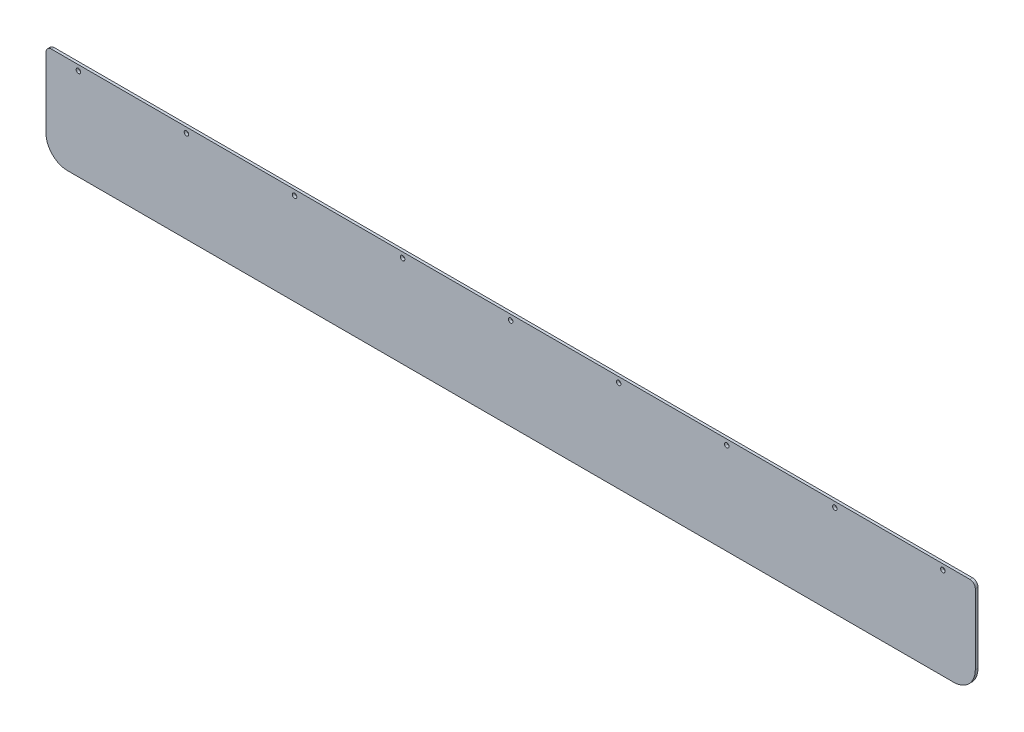
ISO-10303-21;
HEADER;
FILE_DESCRIPTION(('STEP AP214'),'2;1');
FILE_NAME('part.step','',(''),(''),'','','');
FILE_SCHEMA(('AUTOMOTIVE_DESIGN { 1 0 10303 214 1 1 1 1 }'));
ENDSEC;
DATA;
#1=APPLICATION_CONTEXT('core data for automotive mechanical design processes');
#2=APPLICATION_PROTOCOL_DEFINITION('international standard','automotive_design',2000,#1);
#3=PRODUCT_CONTEXT('',#1,'mechanical');
#4=PRODUCT('Part','Part','',(#3));
#5=PRODUCT_RELATED_PRODUCT_CATEGORY('part','',(#4));
#6=PRODUCT_DEFINITION_FORMATION('','',#4);
#7=PRODUCT_DEFINITION_CONTEXT('part definition',#1,'design');
#8=PRODUCT_DEFINITION('design','',#6,#7);
#9=PRODUCT_DEFINITION_SHAPE('','',#8);
#10=(LENGTH_UNIT() NAMED_UNIT(*) SI_UNIT(.MILLI.,.METRE.));
#11=(NAMED_UNIT(*) PLANE_ANGLE_UNIT() SI_UNIT($,.RADIAN.));
#12=(NAMED_UNIT(*) SI_UNIT($,.STERADIAN.) SOLID_ANGLE_UNIT());
#13=UNCERTAINTY_MEASURE_WITH_UNIT(LENGTH_MEASURE(1.E-05),#10,'distance_accuracy_value','');
#14=(GEOMETRIC_REPRESENTATION_CONTEXT(3) GLOBAL_UNCERTAINTY_ASSIGNED_CONTEXT((#13)) GLOBAL_UNIT_ASSIGNED_CONTEXT((#10,
#11,#12)) REPRESENTATION_CONTEXT('',''));
#15=CARTESIAN_POINT('',(0.,0.,0.));
#16=DIRECTION('',(0.,0.,1.));
#17=DIRECTION('',(1.,0.,0.));
#18=AXIS2_PLACEMENT_3D('',#15,#16,#17);
#19=CARTESIAN_POINT('',(76.2,228.6,63.5));
#20=DIRECTION('',(0.,0.,1.));
#21=DIRECTION('',(1.,0.,0.));
#22=AXIS2_PLACEMENT_3D('',#19,#20,#21);
#23=PLANE('',#22);
#24=CARTESIAN_POINT('',(152.4,215.9,63.5));
#25=DIRECTION('',(0.,0.,1.));
#26=DIRECTION('',(1.,0.,0.));
#27=AXIS2_PLACEMENT_3D('',#24,#25,#26);
#28=CIRCLE('',#27,5.3578125);
#29=CARTESIAN_POINT('',(157.7578125,215.9,63.5));
#30=VERTEX_POINT('',#29);
#31=EDGE_CURVE('E135',#30,#30,#28,.T.);
#32=ORIENTED_EDGE('',*,*,#31,.T.);
#33=EDGE_LOOP('',(#32));
#34=FACE_BOUND('',#33,.T.);
#35=CARTESIAN_POINT('',(406.4,215.9,63.5));
#36=DIRECTION('',(0.,0.,1.));
#37=DIRECTION('',(1.,0.,0.));
#38=AXIS2_PLACEMENT_3D('',#35,#36,#37);
#39=CIRCLE('',#38,5.35781249999996);
#40=CARTESIAN_POINT('',(411.7578125,215.9,63.5));
#41=VERTEX_POINT('',#40);
#42=EDGE_CURVE('E286',#41,#41,#39,.T.);
#43=ORIENTED_EDGE('',*,*,#42,.T.);
#44=EDGE_LOOP('',(#43));
#45=FACE_BOUND('',#44,.T.);
#46=CARTESIAN_POINT('',(660.4,215.9,63.5));
#47=DIRECTION('',(0.,0.,1.));
#48=DIRECTION('',(1.,0.,0.));
#49=AXIS2_PLACEMENT_3D('',#46,#47,#48);
#50=CIRCLE('',#49,5.35781249999997);
#51=CARTESIAN_POINT('',(665.7578125,215.9,63.5));
#52=VERTEX_POINT('',#51);
#53=EDGE_CURVE('E292',#52,#52,#50,.T.);
#54=ORIENTED_EDGE('',*,*,#53,.T.);
#55=EDGE_LOOP('',(#54));
#56=FACE_BOUND('',#55,.T.);
#57=CARTESIAN_POINT('',(914.4,215.9,63.5));
#58=DIRECTION('',(0.,0.,1.));
#59=DIRECTION('',(1.,0.,0.));
#60=AXIS2_PLACEMENT_3D('',#57,#58,#59);
#61=CIRCLE('',#60,5.35781249999997);
#62=CARTESIAN_POINT('',(919.7578125,215.9,63.5));
#63=VERTEX_POINT('',#62);
#64=EDGE_CURVE('E307',#63,#63,#61,.T.);
#65=ORIENTED_EDGE('',*,*,#64,.T.);
#66=EDGE_LOOP('',(#65));
#67=FACE_BOUND('',#66,.T.);
#68=CARTESIAN_POINT('',(1168.4,215.9,63.5));
#69=DIRECTION('',(0.,0.,1.));
#70=DIRECTION('',(1.,0.,0.));
#71=AXIS2_PLACEMENT_3D('',#68,#69,#70);
#72=CIRCLE('',#71,5.35781250000008);
#73=CARTESIAN_POINT('',(1173.7578125,215.9,63.5));
#74=VERTEX_POINT('',#73);
#75=EDGE_CURVE('E315',#74,#74,#72,.T.);
#76=ORIENTED_EDGE('',*,*,#75,.T.);
#77=EDGE_LOOP('',(#76));
#78=FACE_BOUND('',#77,.T.);
#79=CARTESIAN_POINT('',(1422.4,215.9,63.5));
#80=DIRECTION('',(0.,0.,1.));
#81=DIRECTION('',(1.,0.,0.));
#82=AXIS2_PLACEMENT_3D('',#79,#80,#81);
#83=CIRCLE('',#82,5.35781250000008);
#84=CARTESIAN_POINT('',(1427.7578125,215.9,63.5));
#85=VERTEX_POINT('',#84);
#86=EDGE_CURVE('E323',#85,#85,#83,.T.);
#87=ORIENTED_EDGE('',*,*,#86,.T.);
#88=EDGE_LOOP('',(#87));
#89=FACE_BOUND('',#88,.T.);
#90=CARTESIAN_POINT('',(1676.4,215.9,63.5));
#91=DIRECTION('',(0.,0.,1.));
#92=DIRECTION('',(1.,0.,0.));
#93=AXIS2_PLACEMENT_3D('',#90,#91,#92);
#94=CIRCLE('',#93,5.35781250000008);
#95=CARTESIAN_POINT('',(1681.7578125,215.9,63.5));
#96=VERTEX_POINT('',#95);
#97=EDGE_CURVE('E331',#96,#96,#94,.T.);
#98=ORIENTED_EDGE('',*,*,#97,.T.);
#99=EDGE_LOOP('',(#98));
#100=FACE_BOUND('',#99,.T.);
#101=CARTESIAN_POINT('',(1930.4,215.9,63.5));
#102=DIRECTION('',(0.,0.,1.));
#103=DIRECTION('',(1.,0.,0.));
#104=AXIS2_PLACEMENT_3D('',#101,#102,#103);
#105=CIRCLE('',#104,5.35781250000008);
#106=CARTESIAN_POINT('',(1935.7578125,215.9,63.5));
#107=VERTEX_POINT('',#106);
#108=EDGE_CURVE('E339',#107,#107,#105,.T.);
#109=ORIENTED_EDGE('',*,*,#108,.T.);
#110=EDGE_LOOP('',(#109));
#111=FACE_BOUND('',#110,.T.);
#112=CARTESIAN_POINT('',(2184.4,215.9,63.5));
#113=DIRECTION('',(0.,0.,1.));
#114=DIRECTION('',(1.,0.,0.));
#115=AXIS2_PLACEMENT_3D('',#112,#113,#114);
#116=CIRCLE('',#115,5.3578125000001);
#117=CARTESIAN_POINT('',(2189.7578125,215.9,63.5));
#118=VERTEX_POINT('',#117);
#119=EDGE_CURVE('E346',#118,#118,#116,.T.);
#120=ORIENTED_EDGE('',*,*,#119,.T.);
#121=EDGE_LOOP('',(#120));
#122=FACE_BOUND('',#121,.T.);
#123=DIRECTION('',(0.,-1.,0.));
#124=VECTOR('',#123,1.);
#125=CARTESIAN_POINT('',(76.2,228.6,63.5));
#126=LINE('',#125,#124);
#127=CARTESIAN_POINT('',(76.2,215.9,63.5));
#128=VERTEX_POINT('',#127);
#129=CARTESIAN_POINT('',(76.2,50.8,63.5));
#130=VERTEX_POINT('',#129);
#131=EDGE_CURVE('E141',#128,#130,#126,.T.);
#132=ORIENTED_EDGE('',*,*,#131,.F.);
#133=CARTESIAN_POINT('',(88.9,215.9,63.5));
#134=DIRECTION('',(0.,0.,1.));
#135=DIRECTION('',(1.,0.,0.));
#136=AXIS2_PLACEMENT_3D('',#133,#134,#135);
#137=CIRCLE('',#136,12.7);
#138=CARTESIAN_POINT('',(88.9,228.6,63.5));
#139=VERTEX_POINT('',#138);
#140=EDGE_CURVE('E172',#128,#139,#137,.F.);
#141=ORIENTED_EDGE('',*,*,#140,.T.);
#142=DIRECTION('',(1.,0.,0.));
#143=VECTOR('',#142,1.);
#144=CARTESIAN_POINT('',(76.2,228.6,63.5));
#145=LINE('',#144,#143);
#146=CARTESIAN_POINT('',(2247.9,228.6,63.5));
#147=VERTEX_POINT('',#146);
#148=EDGE_CURVE('E198',#147,#139,#145,.F.);
#149=ORIENTED_EDGE('',*,*,#148,.F.);
#150=CARTESIAN_POINT('',(2247.9,215.9,63.5));
#151=DIRECTION('',(0.,0.,1.));
#152=DIRECTION('',(1.,0.,0.));
#153=AXIS2_PLACEMENT_3D('',#150,#151,#152);
#154=CIRCLE('',#153,12.7);
#155=CARTESIAN_POINT('',(2260.6,215.9,63.5));
#156=VERTEX_POINT('',#155);
#157=EDGE_CURVE('E169',#147,#156,#154,.F.);
#158=ORIENTED_EDGE('',*,*,#157,.T.);
#159=DIRECTION('',(0.,-1.,0.));
#160=VECTOR('',#159,1.);
#161=CARTESIAN_POINT('',(2260.6,228.6,63.5));
#162=LINE('',#161,#160);
#163=CARTESIAN_POINT('',(2260.6,50.8,63.5));
#164=VERTEX_POINT('',#163);
#165=EDGE_CURVE('E116',#156,#164,#162,.T.);
#166=ORIENTED_EDGE('',*,*,#165,.T.);
#167=CARTESIAN_POINT('',(2209.8,50.8,63.5));
#168=DIRECTION('',(0.,0.,1.));
#169=DIRECTION('',(1.,0.,0.));
#170=AXIS2_PLACEMENT_3D('',#167,#168,#169);
#171=CIRCLE('',#170,50.8);
#172=CARTESIAN_POINT('',(2209.8,0.,63.5));
#173=VERTEX_POINT('',#172);
#174=EDGE_CURVE('E110',#164,#173,#171,.F.);
#175=ORIENTED_EDGE('',*,*,#174,.T.);
#176=DIRECTION('',(1.,0.,0.));
#177=VECTOR('',#176,1.);
#178=CARTESIAN_POINT('',(76.2,0.,63.5));
#179=LINE('',#178,#177);
#180=CARTESIAN_POINT('',(127.,0.,63.5));
#181=VERTEX_POINT('',#180);
#182=EDGE_CURVE('E114',#173,#181,#179,.F.);
#183=ORIENTED_EDGE('',*,*,#182,.T.);
#184=CARTESIAN_POINT('',(127.,50.8,63.5));
#185=DIRECTION('',(0.,0.,1.));
#186=DIRECTION('',(1.,0.,0.));
#187=AXIS2_PLACEMENT_3D('',#184,#185,#186);
#188=CIRCLE('',#187,50.8);
#189=EDGE_CURVE('E122',#181,#130,#188,.F.);
#190=ORIENTED_EDGE('',*,*,#189,.T.);
#191=EDGE_LOOP('',(#132,#141,#149,#158,#166,#175,#183,#190));
#192=FACE_BOUND('',#191,.T.);
#193=ADVANCED_FACE('F42',(#34,#45,#56,#67,#78,#89,#100,#111,#122,#192),#23,.F.);
#194=CARTESIAN_POINT('',(76.2,228.6,69.85));
#195=DIRECTION('',(-1.,0.,0.));
#196=DIRECTION('',(0.,0.,1.));
#197=AXIS2_PLACEMENT_3D('',#194,#195,#196);
#198=PLANE('',#197);
#199=DIRECTION('',(0.,-1.,0.));
#200=VECTOR('',#199,1.);
#201=CARTESIAN_POINT('',(76.2,228.6,69.85));
#202=LINE('',#201,#200);
#203=CARTESIAN_POINT('',(76.2,215.9,69.85));
#204=VERTEX_POINT('',#203);
#205=CARTESIAN_POINT('',(76.2,50.8,69.85));
#206=VERTEX_POINT('',#205);
#207=EDGE_CURVE('E147',#204,#206,#202,.T.);
#208=ORIENTED_EDGE('',*,*,#207,.F.);
#209=DIRECTION('',(0.,0.,-1.));
#210=VECTOR('',#209,1.);
#211=CARTESIAN_POINT('',(76.2,215.9,69.85));
#212=LINE('',#211,#210);
#213=EDGE_CURVE('E165',#204,#128,#212,.T.);
#214=ORIENTED_EDGE('',*,*,#213,.T.);
#215=ORIENTED_EDGE('',*,*,#131,.T.);
#216=DIRECTION('',(0.,0.,-1.));
#217=VECTOR('',#216,1.);
#218=CARTESIAN_POINT('',(76.2,50.8,69.85));
#219=LINE('',#218,#217);
#220=EDGE_CURVE('E153',#130,#206,#219,.F.);
#221=ORIENTED_EDGE('',*,*,#220,.T.);
#222=EDGE_LOOP('',(#208,#214,#215,#221));
#223=FACE_BOUND('',#222,.T.);
#224=ADVANCED_FACE('F191',(#223),#198,.T.);
#225=CARTESIAN_POINT('',(76.2,228.6,69.85));
#226=DIRECTION('',(0.,0.,1.));
#227=DIRECTION('',(1.,0.,0.));
#228=AXIS2_PLACEMENT_3D('',#225,#226,#227);
#229=PLANE('',#228);
#230=CARTESIAN_POINT('',(152.4,215.9,69.85));
#231=DIRECTION('',(0.,0.,1.));
#232=DIRECTION('',(1.,0.,0.));
#233=AXIS2_PLACEMENT_3D('',#230,#231,#232);
#234=CIRCLE('',#233,5.3578125);
#235=CARTESIAN_POINT('',(157.7578125,215.9,69.85));
#236=VERTEX_POINT('',#235);
#237=EDGE_CURVE('E297',#236,#236,#234,.T.);
#238=ORIENTED_EDGE('',*,*,#237,.F.);
#239=EDGE_LOOP('',(#238));
#240=FACE_BOUND('',#239,.T.);
#241=CARTESIAN_POINT('',(406.4,215.9,69.85));
#242=DIRECTION('',(0.,0.,1.));
#243=DIRECTION('',(1.,0.,0.));
#244=AXIS2_PLACEMENT_3D('',#241,#242,#243);
#245=CIRCLE('',#244,5.35781249999996);
#246=CARTESIAN_POINT('',(411.7578125,215.9,69.85));
#247=VERTEX_POINT('',#246);
#248=EDGE_CURVE('E289',#247,#247,#245,.T.);
#249=ORIENTED_EDGE('',*,*,#248,.F.);
#250=EDGE_LOOP('',(#249));
#251=FACE_BOUND('',#250,.T.);
#252=CARTESIAN_POINT('',(660.4,215.9,69.85));
#253=DIRECTION('',(0.,0.,1.));
#254=DIRECTION('',(1.,0.,0.));
#255=AXIS2_PLACEMENT_3D('',#252,#253,#254);
#256=CIRCLE('',#255,5.35781249999997);
#257=CARTESIAN_POINT('',(665.7578125,215.9,69.85));
#258=VERTEX_POINT('',#257);
#259=EDGE_CURVE('E300',#258,#258,#256,.T.);
#260=ORIENTED_EDGE('',*,*,#259,.F.);
#261=EDGE_LOOP('',(#260));
#262=FACE_BOUND('',#261,.T.);
#263=CARTESIAN_POINT('',(914.4,215.9,69.85));
#264=DIRECTION('',(0.,0.,1.));
#265=DIRECTION('',(1.,0.,0.));
#266=AXIS2_PLACEMENT_3D('',#263,#264,#265);
#267=CIRCLE('',#266,5.35781249999997);
#268=CARTESIAN_POINT('',(919.7578125,215.9,69.85));
#269=VERTEX_POINT('',#268);
#270=EDGE_CURVE('E311',#269,#269,#267,.T.);
#271=ORIENTED_EDGE('',*,*,#270,.F.);
#272=EDGE_LOOP('',(#271));
#273=FACE_BOUND('',#272,.T.);
#274=CARTESIAN_POINT('',(1168.4,215.9,69.85));
#275=DIRECTION('',(0.,0.,1.));
#276=DIRECTION('',(1.,0.,0.));
#277=AXIS2_PLACEMENT_3D('',#274,#275,#276);
#278=CIRCLE('',#277,5.35781250000008);
#279=CARTESIAN_POINT('',(1173.7578125,215.9,69.85));
#280=VERTEX_POINT('',#279);
#281=EDGE_CURVE('E319',#280,#280,#278,.T.);
#282=ORIENTED_EDGE('',*,*,#281,.F.);
#283=EDGE_LOOP('',(#282));
#284=FACE_BOUND('',#283,.T.);
#285=CARTESIAN_POINT('',(1422.4,215.9,69.85));
#286=DIRECTION('',(0.,0.,1.));
#287=DIRECTION('',(1.,0.,0.));
#288=AXIS2_PLACEMENT_3D('',#285,#286,#287);
#289=CIRCLE('',#288,5.35781250000008);
#290=CARTESIAN_POINT('',(1427.7578125,215.9,69.85));
#291=VERTEX_POINT('',#290);
#292=EDGE_CURVE('E327',#291,#291,#289,.T.);
#293=ORIENTED_EDGE('',*,*,#292,.F.);
#294=EDGE_LOOP('',(#293));
#295=FACE_BOUND('',#294,.T.);
#296=CARTESIAN_POINT('',(1676.4,215.9,69.85));
#297=DIRECTION('',(0.,0.,1.));
#298=DIRECTION('',(1.,0.,0.));
#299=AXIS2_PLACEMENT_3D('',#296,#297,#298);
#300=CIRCLE('',#299,5.35781250000008);
#301=CARTESIAN_POINT('',(1681.7578125,215.9,69.85));
#302=VERTEX_POINT('',#301);
#303=EDGE_CURVE('E335',#302,#302,#300,.T.);
#304=ORIENTED_EDGE('',*,*,#303,.F.);
#305=EDGE_LOOP('',(#304));
#306=FACE_BOUND('',#305,.T.);
#307=CARTESIAN_POINT('',(1930.4,215.9,69.85));
#308=DIRECTION('',(0.,0.,1.));
#309=DIRECTION('',(1.,0.,0.));
#310=AXIS2_PLACEMENT_3D('',#307,#308,#309);
#311=CIRCLE('',#310,5.35781250000008);
#312=CARTESIAN_POINT('',(1935.7578125,215.9,69.85));
#313=VERTEX_POINT('',#312);
#314=EDGE_CURVE('E343',#313,#313,#311,.T.);
#315=ORIENTED_EDGE('',*,*,#314,.F.);
#316=EDGE_LOOP('',(#315));
#317=FACE_BOUND('',#316,.T.);
#318=CARTESIAN_POINT('',(2184.4,215.9,69.85));
#319=DIRECTION('',(0.,0.,1.));
#320=DIRECTION('',(1.,0.,0.));
#321=AXIS2_PLACEMENT_3D('',#318,#319,#320);
#322=CIRCLE('',#321,5.3578125000001);
#323=CARTESIAN_POINT('',(2189.7578125,215.9,69.85));
#324=VERTEX_POINT('',#323);
#325=EDGE_CURVE('E209',#324,#324,#322,.T.);
#326=ORIENTED_EDGE('',*,*,#325,.F.);
#327=EDGE_LOOP('',(#326));
#328=FACE_BOUND('',#327,.T.);
#329=DIRECTION('',(-1.,0.,0.));
#330=VECTOR('',#329,1.);
#331=CARTESIAN_POINT('',(76.2,228.6,69.85));
#332=LINE('',#331,#330);
#333=CARTESIAN_POINT('',(2247.9,228.6,69.85));
#334=VERTEX_POINT('',#333);
#335=CARTESIAN_POINT('',(88.9,228.6,69.85));
#336=VERTEX_POINT('',#335);
#337=EDGE_CURVE('E187',#334,#336,#332,.T.);
#338=ORIENTED_EDGE('',*,*,#337,.T.);
#339=CARTESIAN_POINT('',(88.9,215.9,69.85));
#340=DIRECTION('',(0.,0.,1.));
#341=DIRECTION('',(1.,0.,0.));
#342=AXIS2_PLACEMENT_3D('',#339,#340,#341);
#343=CIRCLE('',#342,12.7);
#344=EDGE_CURVE('E51',#336,#204,#343,.T.);
#345=ORIENTED_EDGE('',*,*,#344,.T.);
#346=ORIENTED_EDGE('',*,*,#207,.T.);
#347=CARTESIAN_POINT('',(127.,50.8,69.85));
#348=DIRECTION('',(0.,0.,1.));
#349=DIRECTION('',(1.,0.,0.));
#350=AXIS2_PLACEMENT_3D('',#347,#348,#349);
#351=CIRCLE('',#350,50.8);
#352=CARTESIAN_POINT('',(127.,0.,69.85));
#353=VERTEX_POINT('',#352);
#354=EDGE_CURVE('E159',#206,#353,#351,.T.);
#355=ORIENTED_EDGE('',*,*,#354,.T.);
#356=DIRECTION('',(-1.,0.,0.));
#357=VECTOR('',#356,1.);
#358=CARTESIAN_POINT('',(76.2,0.,69.85));
#359=LINE('',#358,#357);
#360=CARTESIAN_POINT('',(2209.8,0.,69.85));
#361=VERTEX_POINT('',#360);
#362=EDGE_CURVE('E134',#361,#353,#359,.T.);
#363=ORIENTED_EDGE('',*,*,#362,.F.);
#364=CARTESIAN_POINT('',(2209.8,50.8,69.85));
#365=DIRECTION('',(0.,0.,1.));
#366=DIRECTION('',(1.,0.,0.));
#367=AXIS2_PLACEMENT_3D('',#364,#365,#366);
#368=CIRCLE('',#367,50.8);
#369=CARTESIAN_POINT('',(2260.6,50.8,69.85));
#370=VERTEX_POINT('',#369);
#371=EDGE_CURVE('E139',#361,#370,#368,.T.);
#372=ORIENTED_EDGE('',*,*,#371,.T.);
#373=DIRECTION('',(0.,-1.,0.));
#374=VECTOR('',#373,1.);
#375=CARTESIAN_POINT('',(2260.6,228.6,69.85));
#376=LINE('',#375,#374);
#377=CARTESIAN_POINT('',(2260.6,215.9,69.85));
#378=VERTEX_POINT('',#377);
#379=EDGE_CURVE('E195',#378,#370,#376,.T.);
#380=ORIENTED_EDGE('',*,*,#379,.F.);
#381=CARTESIAN_POINT('',(2247.9,215.9,69.85));
#382=DIRECTION('',(0.,0.,1.));
#383=DIRECTION('',(1.,0.,0.));
#384=AXIS2_PLACEMENT_3D('',#381,#382,#383);
#385=CIRCLE('',#384,12.7);
#386=EDGE_CURVE('E58',#378,#334,#385,.T.);
#387=ORIENTED_EDGE('',*,*,#386,.T.);
#388=EDGE_LOOP('',(#338,#345,#346,#355,#363,#372,#380,#387));
#389=FACE_BOUND('',#388,.T.);
#390=ADVANCED_FACE('F186',(#240,#251,#262,#273,#284,#295,#306,#317,#328,#389),#229,.T.);
#391=CARTESIAN_POINT('',(2260.6,228.6,63.5));
#392=DIRECTION('',(1.,0.,0.));
#393=DIRECTION('',(0.,0.,-1.));
#394=AXIS2_PLACEMENT_3D('',#391,#392,#393);
#395=PLANE('',#394);
#396=ORIENTED_EDGE('',*,*,#165,.F.);
#397=DIRECTION('',(0.,0.,1.));
#398=VECTOR('',#397,1.);
#399=CARTESIAN_POINT('',(2260.6,215.9,63.5));
#400=LINE('',#399,#398);
#401=EDGE_CURVE('E11',#156,#378,#400,.T.);
#402=ORIENTED_EDGE('',*,*,#401,.T.);
#403=ORIENTED_EDGE('',*,*,#379,.T.);
#404=DIRECTION('',(0.,0.,1.));
#405=VECTOR('',#404,1.);
#406=CARTESIAN_POINT('',(2260.6,50.8,63.5));
#407=LINE('',#406,#405);
#408=EDGE_CURVE('E162',#370,#164,#407,.F.);
#409=ORIENTED_EDGE('',*,*,#408,.T.);
#410=EDGE_LOOP('',(#396,#402,#403,#409));
#411=FACE_BOUND('',#410,.T.);
#412=ADVANCED_FACE('F218',(#411),#395,.T.);
#413=CARTESIAN_POINT('',(0.,228.6,0.));
#414=DIRECTION('',(0.,1.,0.));
#415=DIRECTION('',(1.,0.,0.));
#416=AXIS2_PLACEMENT_3D('',#413,#414,#415);
#417=PLANE('',#416);
#418=ORIENTED_EDGE('',*,*,#148,.T.);
#419=DIRECTION('',(0.,0.,-1.));
#420=VECTOR('',#419,1.);
#421=CARTESIAN_POINT('',(88.9,228.6,0.));
#422=LINE('',#421,#420);
#423=EDGE_CURVE('E65',#139,#336,#422,.F.);
#424=ORIENTED_EDGE('',*,*,#423,.T.);
#425=ORIENTED_EDGE('',*,*,#337,.F.);
#426=DIRECTION('',(0.,0.,1.));
#427=VECTOR('',#426,1.);
#428=CARTESIAN_POINT('',(2247.9,228.6,0.));
#429=LINE('',#428,#427);
#430=EDGE_CURVE('E175',#334,#147,#429,.F.);
#431=ORIENTED_EDGE('',*,*,#430,.T.);
#432=EDGE_LOOP('',(#418,#424,#425,#431));
#433=FACE_BOUND('',#432,.T.);
#434=ADVANCED_FACE('F200',(#433),#417,.T.);
#435=CARTESIAN_POINT('',(0.,0.,0.));
#436=DIRECTION('',(0.,1.,0.));
#437=DIRECTION('',(1.,0.,0.));
#438=AXIS2_PLACEMENT_3D('',#435,#436,#437);
#439=PLANE('',#438);
#440=ORIENTED_EDGE('',*,*,#362,.T.);
#441=DIRECTION('',(0.,0.,-1.));
#442=VECTOR('',#441,1.);
#443=CARTESIAN_POINT('',(127.,0.,63.5));
#444=LINE('',#443,#442);
#445=EDGE_CURVE('E123',#353,#181,#444,.T.);
#446=ORIENTED_EDGE('',*,*,#445,.T.);
#447=ORIENTED_EDGE('',*,*,#182,.F.);
#448=DIRECTION('',(0.,0.,1.));
#449=VECTOR('',#448,1.);
#450=CARTESIAN_POINT('',(2209.8,0.,69.85));
#451=LINE('',#450,#449);
#452=EDGE_CURVE('E130',#173,#361,#451,.T.);
#453=ORIENTED_EDGE('',*,*,#452,.T.);
#454=EDGE_LOOP('',(#440,#446,#447,#453));
#455=FACE_BOUND('',#454,.T.);
#456=ADVANCED_FACE('F129',(#455),#439,.F.);
#457=CARTESIAN_POINT('',(2184.4,215.9,63.5));
#458=DIRECTION('',(0.,0.,1.));
#459=DIRECTION('',(1.,0.,0.));
#460=AXIS2_PLACEMENT_3D('',#457,#458,#459);
#461=CYLINDRICAL_SURFACE('',#460,5.3578125000001);
#462=ORIENTED_EDGE('',*,*,#119,.F.);
#463=EDGE_LOOP('',(#462));
#464=FACE_BOUND('',#463,.T.);
#465=ORIENTED_EDGE('',*,*,#325,.T.);
#466=EDGE_LOOP('',(#465));
#467=FACE_BOUND('',#466,.T.);
#468=ADVANCED_FACE('F249',(#464,#467),#461,.F.);
#469=CARTESIAN_POINT('',(1930.4,215.9,63.5));
#470=DIRECTION('',(0.,0.,1.));
#471=DIRECTION('',(1.,0.,0.));
#472=AXIS2_PLACEMENT_3D('',#469,#470,#471);
#473=CYLINDRICAL_SURFACE('',#472,5.35781250000008);
#474=ORIENTED_EDGE('',*,*,#108,.F.);
#475=EDGE_LOOP('',(#474));
#476=FACE_BOUND('',#475,.T.);
#477=ORIENTED_EDGE('',*,*,#314,.T.);
#478=EDGE_LOOP('',(#477));
#479=FACE_BOUND('',#478,.T.);
#480=ADVANCED_FACE('F254',(#476,#479),#473,.F.);
#481=CARTESIAN_POINT('',(1676.4,215.9,63.5));
#482=DIRECTION('',(0.,0.,1.));
#483=DIRECTION('',(1.,0.,0.));
#484=AXIS2_PLACEMENT_3D('',#481,#482,#483);
#485=CYLINDRICAL_SURFACE('',#484,5.35781250000008);
#486=ORIENTED_EDGE('',*,*,#97,.F.);
#487=EDGE_LOOP('',(#486));
#488=FACE_BOUND('',#487,.T.);
#489=ORIENTED_EDGE('',*,*,#303,.T.);
#490=EDGE_LOOP('',(#489));
#491=FACE_BOUND('',#490,.T.);
#492=ADVANCED_FACE('F258',(#488,#491),#485,.F.);
#493=CARTESIAN_POINT('',(1422.4,215.9,63.5));
#494=DIRECTION('',(0.,0.,1.));
#495=DIRECTION('',(1.,0.,0.));
#496=AXIS2_PLACEMENT_3D('',#493,#494,#495);
#497=CYLINDRICAL_SURFACE('',#496,5.35781250000008);
#498=ORIENTED_EDGE('',*,*,#86,.F.);
#499=EDGE_LOOP('',(#498));
#500=FACE_BOUND('',#499,.T.);
#501=ORIENTED_EDGE('',*,*,#292,.T.);
#502=EDGE_LOOP('',(#501));
#503=FACE_BOUND('',#502,.T.);
#504=ADVANCED_FACE('F262',(#500,#503),#497,.F.);
#505=CARTESIAN_POINT('',(1168.4,215.9,63.5));
#506=DIRECTION('',(0.,0.,1.));
#507=DIRECTION('',(1.,0.,0.));
#508=AXIS2_PLACEMENT_3D('',#505,#506,#507);
#509=CYLINDRICAL_SURFACE('',#508,5.35781250000008);
#510=ORIENTED_EDGE('',*,*,#75,.F.);
#511=EDGE_LOOP('',(#510));
#512=FACE_BOUND('',#511,.T.);
#513=ORIENTED_EDGE('',*,*,#281,.T.);
#514=EDGE_LOOP('',(#513));
#515=FACE_BOUND('',#514,.T.);
#516=ADVANCED_FACE('F266',(#512,#515),#509,.F.);
#517=CARTESIAN_POINT('',(914.4,215.9,63.5));
#518=DIRECTION('',(0.,0.,1.));
#519=DIRECTION('',(1.,0.,0.));
#520=AXIS2_PLACEMENT_3D('',#517,#518,#519);
#521=CYLINDRICAL_SURFACE('',#520,5.35781249999997);
#522=ORIENTED_EDGE('',*,*,#64,.F.);
#523=EDGE_LOOP('',(#522));
#524=FACE_BOUND('',#523,.T.);
#525=ORIENTED_EDGE('',*,*,#270,.T.);
#526=EDGE_LOOP('',(#525));
#527=FACE_BOUND('',#526,.T.);
#528=ADVANCED_FACE('F270',(#524,#527),#521,.F.);
#529=CARTESIAN_POINT('',(660.4,215.9,63.5));
#530=DIRECTION('',(0.,0.,1.));
#531=DIRECTION('',(1.,0.,0.));
#532=AXIS2_PLACEMENT_3D('',#529,#530,#531);
#533=CYLINDRICAL_SURFACE('',#532,5.35781249999997);
#534=ORIENTED_EDGE('',*,*,#53,.F.);
#535=EDGE_LOOP('',(#534));
#536=FACE_BOUND('',#535,.T.);
#537=ORIENTED_EDGE('',*,*,#259,.T.);
#538=EDGE_LOOP('',(#537));
#539=FACE_BOUND('',#538,.T.);
#540=ADVANCED_FACE('F274',(#536,#539),#533,.F.);
#541=CARTESIAN_POINT('',(406.4,215.9,63.5));
#542=DIRECTION('',(0.,0.,1.));
#543=DIRECTION('',(1.,0.,0.));
#544=AXIS2_PLACEMENT_3D('',#541,#542,#543);
#545=CYLINDRICAL_SURFACE('',#544,5.35781249999996);
#546=ORIENTED_EDGE('',*,*,#42,.F.);
#547=EDGE_LOOP('',(#546));
#548=FACE_BOUND('',#547,.T.);
#549=ORIENTED_EDGE('',*,*,#248,.T.);
#550=EDGE_LOOP('',(#549));
#551=FACE_BOUND('',#550,.T.);
#552=ADVANCED_FACE('F229',(#548,#551),#545,.F.);
#553=CARTESIAN_POINT('',(152.4,215.9,63.5));
#554=DIRECTION('',(0.,0.,1.));
#555=DIRECTION('',(1.,0.,0.));
#556=AXIS2_PLACEMENT_3D('',#553,#554,#555);
#557=CYLINDRICAL_SURFACE('',#556,5.3578125);
#558=ORIENTED_EDGE('',*,*,#31,.F.);
#559=EDGE_LOOP('',(#558));
#560=FACE_BOUND('',#559,.T.);
#561=ORIENTED_EDGE('',*,*,#237,.T.);
#562=EDGE_LOOP('',(#561));
#563=FACE_BOUND('',#562,.T.);
#564=ADVANCED_FACE('F222',(#560,#563),#557,.F.);
#565=CARTESIAN_POINT('',(127.,50.8,0.));
#566=DIRECTION('',(0.,0.,1.));
#567=DIRECTION('',(1.,0.,0.));
#568=AXIS2_PLACEMENT_3D('',#565,#566,#567);
#569=CYLINDRICAL_SURFACE('',#568,50.8);
#570=ORIENTED_EDGE('',*,*,#354,.F.);
#571=ORIENTED_EDGE('',*,*,#220,.F.);
#572=ORIENTED_EDGE('',*,*,#189,.F.);
#573=ORIENTED_EDGE('',*,*,#445,.F.);
#574=EDGE_LOOP('',(#570,#571,#572,#573));
#575=FACE_BOUND('',#574,.T.);
#576=ADVANCED_FACE('F220',(#575),#569,.T.);
#577=CARTESIAN_POINT('',(2209.8,50.8,0.));
#578=DIRECTION('',(0.,0.,-1.));
#579=DIRECTION('',(-1.,0.,0.));
#580=AXIS2_PLACEMENT_3D('',#577,#578,#579);
#581=CYLINDRICAL_SURFACE('',#580,50.8);
#582=ORIENTED_EDGE('',*,*,#174,.F.);
#583=ORIENTED_EDGE('',*,*,#408,.F.);
#584=ORIENTED_EDGE('',*,*,#371,.F.);
#585=ORIENTED_EDGE('',*,*,#452,.F.);
#586=EDGE_LOOP('',(#582,#583,#584,#585));
#587=FACE_BOUND('',#586,.T.);
#588=ADVANCED_FACE('F137',(#587),#581,.T.);
#589=CARTESIAN_POINT('',(88.9,215.9,69.85));
#590=DIRECTION('',(0.,0.,-1.));
#591=DIRECTION('',(-1.,0.,0.));
#592=AXIS2_PLACEMENT_3D('',#589,#590,#591);
#593=CYLINDRICAL_SURFACE('',#592,12.7);
#594=ORIENTED_EDGE('',*,*,#344,.F.);
#595=ORIENTED_EDGE('',*,*,#423,.F.);
#596=ORIENTED_EDGE('',*,*,#140,.F.);
#597=ORIENTED_EDGE('',*,*,#213,.F.);
#598=EDGE_LOOP('',(#594,#595,#596,#597));
#599=FACE_BOUND('',#598,.T.);
#600=ADVANCED_FACE('F196',(#599),#593,.T.);
#601=CARTESIAN_POINT('',(2247.9,215.9,63.5));
#602=DIRECTION('',(0.,0.,1.));
#603=DIRECTION('',(1.,0.,0.));
#604=AXIS2_PLACEMENT_3D('',#601,#602,#603);
#605=CYLINDRICAL_SURFACE('',#604,12.7);
#606=ORIENTED_EDGE('',*,*,#157,.F.);
#607=ORIENTED_EDGE('',*,*,#430,.F.);
#608=ORIENTED_EDGE('',*,*,#386,.F.);
#609=ORIENTED_EDGE('',*,*,#401,.F.);
#610=EDGE_LOOP('',(#606,#607,#608,#609));
#611=FACE_BOUND('',#610,.T.);
#612=ADVANCED_FACE('F44',(#611),#605,.T.);
#613=CLOSED_SHELL('',(#193,#224,#390,#412,#434,#456,#468,#480,#492,#504,#516,#528,#540,#552,
#564,#576,#588,#600,#612));
#614=MANIFOLD_SOLID_BREP('B2',#613);
#615=ADVANCED_BREP_SHAPE_REPRESENTATION('',(#18,#614),#14);
#616=SHAPE_DEFINITION_REPRESENTATION(#9,#615);
ENDSEC;
END-ISO-10303-21;
